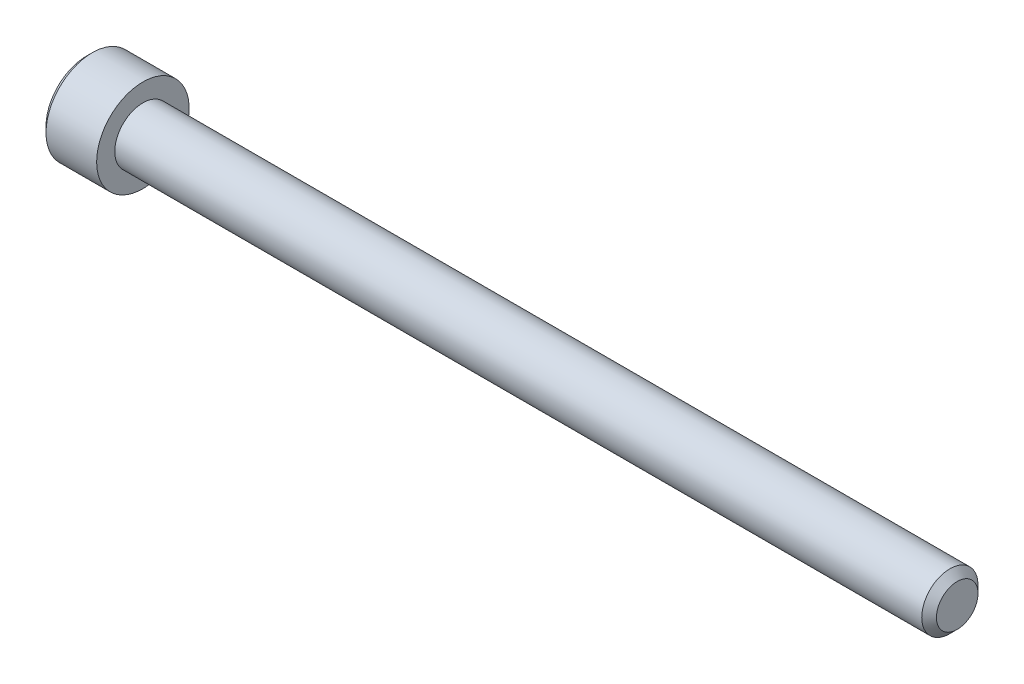
ISO-10303-21;
HEADER;
FILE_DESCRIPTION(('STEP AP214'),'2;1');
FILE_NAME('part.step','',(''),(''),'','','');
FILE_SCHEMA(('AUTOMOTIVE_DESIGN { 1 0 10303 214 1 1 1 1 }'));
ENDSEC;
DATA;
#1=APPLICATION_CONTEXT('core data for automotive mechanical design processes');
#2=APPLICATION_PROTOCOL_DEFINITION('international standard','automotive_design',2000,#1);
#3=PRODUCT_CONTEXT('',#1,'mechanical');
#4=PRODUCT('Part','Part','',(#3));
#5=PRODUCT_RELATED_PRODUCT_CATEGORY('part','',(#4));
#6=PRODUCT_DEFINITION_FORMATION('','',#4);
#7=PRODUCT_DEFINITION_CONTEXT('part definition',#1,'design');
#8=PRODUCT_DEFINITION('design','',#6,#7);
#9=PRODUCT_DEFINITION_SHAPE('','',#8);
#10=(LENGTH_UNIT() NAMED_UNIT(*) SI_UNIT(.MILLI.,.METRE.));
#11=(NAMED_UNIT(*) PLANE_ANGLE_UNIT() SI_UNIT($,.RADIAN.));
#12=(NAMED_UNIT(*) SI_UNIT($,.STERADIAN.) SOLID_ANGLE_UNIT());
#13=UNCERTAINTY_MEASURE_WITH_UNIT(LENGTH_MEASURE(1.E-05),#10,'distance_accuracy_value','');
#14=(GEOMETRIC_REPRESENTATION_CONTEXT(3) GLOBAL_UNCERTAINTY_ASSIGNED_CONTEXT((#13)) GLOBAL_UNIT_ASSIGNED_CONTEXT((#10,
#11,#12)) REPRESENTATION_CONTEXT('',''));
#15=CARTESIAN_POINT('',(0.,0.,0.));
#16=DIRECTION('',(0.,0.,1.));
#17=DIRECTION('',(1.,0.,0.));
#18=AXIS2_PLACEMENT_3D('',#15,#16,#17);
#19=CARTESIAN_POINT('',(-4.826,0.,0.));
#20=DIRECTION('',(-1.,0.,0.));
#21=DIRECTION('',(0.,0.,1.));
#22=AXIS2_PLACEMENT_3D('',#19,#20,#21);
#23=CYLINDRICAL_SURFACE('',#22,2.413);
#24=CARTESIAN_POINT('',(0.,0.,0.));
#25=DIRECTION('',(-1.,0.,0.));
#26=DIRECTION('',(0.,0.,1.));
#27=AXIS2_PLACEMENT_3D('',#24,#25,#26);
#28=CIRCLE('',#27,2.413);
#29=CARTESIAN_POINT('',(0.,0.,2.413));
#30=VERTEX_POINT('',#29);
#31=EDGE_CURVE('E137',#30,#30,#28,.T.);
#32=ORIENTED_EDGE('',*,*,#31,.F.);
#33=EDGE_LOOP('',(#32));
#34=FACE_BOUND('',#33,.T.);
#35=CARTESIAN_POINT('',(69.22008,0.,0.));
#36=DIRECTION('',(-1.,0.,0.));
#37=DIRECTION('',(0.,0.,1.));
#38=AXIS2_PLACEMENT_3D('',#35,#36,#37);
#39=CIRCLE('',#38,2.413);
#40=CARTESIAN_POINT('',(69.22008,0.,2.413));
#41=VERTEX_POINT('',#40);
#42=EDGE_CURVE('E11',#41,#41,#39,.T.);
#43=ORIENTED_EDGE('',*,*,#42,.T.);
#44=EDGE_LOOP('',(#43));
#45=FACE_BOUND('',#44,.T.);
#46=ADVANCED_FACE('F36',(#34,#45),#23,.T.);
#47=CARTESIAN_POINT('',(69.85,0.,0.));
#48=DIRECTION('',(-1.,0.,0.));
#49=DIRECTION('',(0.,0.,1.));
#50=AXIS2_PLACEMENT_3D('',#47,#48,#49);
#51=CONICAL_SURFACE('',#50,1.78308,0.785398163397454);
#52=ORIENTED_EDGE('',*,*,#42,.F.);
#53=EDGE_LOOP('',(#52));
#54=FACE_BOUND('',#53,.T.);
#55=CARTESIAN_POINT('',(69.85,0.,0.));
#56=DIRECTION('',(-1.,0.,0.));
#57=DIRECTION('',(0.,0.,1.));
#58=AXIS2_PLACEMENT_3D('',#55,#56,#57);
#59=CIRCLE('',#58,1.78308);
#60=CARTESIAN_POINT('',(69.85,0.,1.78308));
#61=VERTEX_POINT('',#60);
#62=EDGE_CURVE('E43',#61,#61,#59,.T.);
#63=ORIENTED_EDGE('',*,*,#62,.T.);
#64=EDGE_LOOP('',(#63));
#65=FACE_BOUND('',#64,.T.);
#66=ADVANCED_FACE('F156',(#54,#65),#51,.T.);
#67=CARTESIAN_POINT('',(69.85,0.,-1.78308));
#68=DIRECTION('',(-1.,0.,0.));
#69=DIRECTION('',(0.,0.,1.));
#70=AXIS2_PLACEMENT_3D('',#67,#68,#69);
#71=PLANE('',#70);
#72=ORIENTED_EDGE('',*,*,#62,.F.);
#73=EDGE_LOOP('',(#72));
#74=FACE_BOUND('',#73,.T.);
#75=ADVANCED_FACE('F158',(#74),#71,.F.);
#76=CARTESIAN_POINT('',(-4.826,0.,-3.48615));
#77=DIRECTION('',(1.,0.,0.));
#78=DIRECTION('',(0.,0.,-1.));
#79=AXIS2_PLACEMENT_3D('',#76,#77,#78);
#80=PLANE('',#79);
#81=DIRECTION('',(0.,0.866025403784438,-0.5));
#82=VECTOR('',#81,1.);
#83=CARTESIAN_POINT('',(-4.826,0.,2.2920921156882));
#84=LINE('',#83,#82);
#85=CARTESIAN_POINT('',(-4.826,0.,2.2920921156882));
#86=VERTEX_POINT('',#85);
#87=CARTESIAN_POINT('',(-4.826,1.98501,1.1460460578441));
#88=VERTEX_POINT('',#87);
#89=EDGE_CURVE('E124',#86,#88,#84,.T.);
#90=ORIENTED_EDGE('',*,*,#89,.F.);
#91=DIRECTION('',(0.,0.866025403784439,0.499999999999999));
#92=VECTOR('',#91,1.);
#93=CARTESIAN_POINT('',(-4.826,-1.98501,1.1460460578441));
#94=LINE('',#93,#92);
#95=CARTESIAN_POINT('',(-4.826,-1.98501,1.1460460578441));
#96=VERTEX_POINT('',#95);
#97=EDGE_CURVE('E50',#96,#86,#94,.T.);
#98=ORIENTED_EDGE('',*,*,#97,.F.);
#99=DIRECTION('',(0.,0.,1.));
#100=VECTOR('',#99,1.);
#101=CARTESIAN_POINT('',(-4.826,-1.98501,-1.1460460578441));
#102=LINE('',#101,#100);
#103=CARTESIAN_POINT('',(-4.826,-1.98501,-1.1460460578441));
#104=VERTEX_POINT('',#103);
#105=EDGE_CURVE('E133',#104,#96,#102,.T.);
#106=ORIENTED_EDGE('',*,*,#105,.F.);
#107=DIRECTION('',(0.,-0.866025403784438,0.5));
#108=VECTOR('',#107,1.);
#109=CARTESIAN_POINT('',(-4.826,0.,-2.2920921156882));
#110=LINE('',#109,#108);
#111=CARTESIAN_POINT('',(-4.826,0.,-2.2920921156882));
#112=VERTEX_POINT('',#111);
#113=EDGE_CURVE('E131',#112,#104,#110,.T.);
#114=ORIENTED_EDGE('',*,*,#113,.F.);
#115=DIRECTION('',(0.,-0.866025403784439,-0.5));
#116=VECTOR('',#115,1.);
#117=CARTESIAN_POINT('',(-4.826,1.98501,-1.1460460578441));
#118=LINE('',#117,#116);
#119=CARTESIAN_POINT('',(-4.826,1.98501,-1.1460460578441));
#120=VERTEX_POINT('',#119);
#121=EDGE_CURVE('E98',#120,#112,#118,.T.);
#122=ORIENTED_EDGE('',*,*,#121,.F.);
#123=DIRECTION('',(0.,0.,-1.));
#124=VECTOR('',#123,1.);
#125=CARTESIAN_POINT('',(-4.826,1.98501,1.1460460578441));
#126=LINE('',#125,#124);
#127=EDGE_CURVE('E127',#88,#120,#126,.T.);
#128=ORIENTED_EDGE('',*,*,#127,.F.);
#129=EDGE_LOOP('',(#90,#98,#106,#114,#122,#128));
#130=FACE_BOUND('',#129,.T.);
#131=CARTESIAN_POINT('',(-4.826,0.,0.));
#132=DIRECTION('',(-1.,0.,0.));
#133=DIRECTION('',(0.,0.,1.));
#134=AXIS2_PLACEMENT_3D('',#131,#132,#133);
#135=CIRCLE('',#134,3.48615);
#136=CARTESIAN_POINT('',(-4.826,0.,3.48615));
#137=VERTEX_POINT('',#136);
#138=EDGE_CURVE('E151',#137,#137,#135,.T.);
#139=ORIENTED_EDGE('',*,*,#138,.T.);
#140=EDGE_LOOP('',(#139));
#141=FACE_BOUND('',#140,.T.);
#142=ADVANCED_FACE('F160',(#130,#141),#80,.F.);
#143=CARTESIAN_POINT('',(-4.3434,0.,0.));
#144=DIRECTION('',(1.,0.,0.));
#145=DIRECTION('',(0.,0.,-1.));
#146=AXIS2_PLACEMENT_3D('',#143,#144,#145);
#147=CONICAL_SURFACE('',#146,3.96875,0.785398163397449);
#148=ORIENTED_EDGE('',*,*,#138,.F.);
#149=EDGE_LOOP('',(#148));
#150=FACE_BOUND('',#149,.T.);
#151=CARTESIAN_POINT('',(-4.3434,0.,0.));
#152=DIRECTION('',(-1.,0.,0.));
#153=DIRECTION('',(0.,0.,1.));
#154=AXIS2_PLACEMENT_3D('',#151,#152,#153);
#155=CIRCLE('',#154,3.96875);
#156=CARTESIAN_POINT('',(-4.3434,0.,3.96875));
#157=VERTEX_POINT('',#156);
#158=EDGE_CURVE('E148',#157,#157,#155,.T.);
#159=ORIENTED_EDGE('',*,*,#158,.T.);
#160=EDGE_LOOP('',(#159));
#161=FACE_BOUND('',#160,.T.);
#162=ADVANCED_FACE('F166',(#150,#161),#147,.T.);
#163=CARTESIAN_POINT('',(-4.826,0.,0.));
#164=DIRECTION('',(-1.,0.,0.));
#165=DIRECTION('',(0.,0.,1.));
#166=AXIS2_PLACEMENT_3D('',#163,#164,#165);
#167=CYLINDRICAL_SURFACE('',#166,3.96875);
#168=ORIENTED_EDGE('',*,*,#158,.F.);
#169=EDGE_LOOP('',(#168));
#170=FACE_BOUND('',#169,.T.);
#171=CARTESIAN_POINT('',(0.,0.,0.));
#172=DIRECTION('',(-1.,0.,0.));
#173=DIRECTION('',(0.,0.,1.));
#174=AXIS2_PLACEMENT_3D('',#171,#172,#173);
#175=CIRCLE('',#174,3.96875);
#176=CARTESIAN_POINT('',(0.,0.,3.96875));
#177=VERTEX_POINT('',#176);
#178=EDGE_CURVE('E145',#177,#177,#175,.T.);
#179=ORIENTED_EDGE('',*,*,#178,.T.);
#180=EDGE_LOOP('',(#179));
#181=FACE_BOUND('',#180,.T.);
#182=ADVANCED_FACE('F181',(#170,#181),#167,.T.);
#183=CARTESIAN_POINT('',(0.,0.,-2.413));
#184=DIRECTION('',(-1.,0.,0.));
#185=DIRECTION('',(0.,0.,1.));
#186=AXIS2_PLACEMENT_3D('',#183,#184,#185);
#187=PLANE('',#186);
#188=ORIENTED_EDGE('',*,*,#178,.F.);
#189=EDGE_LOOP('',(#188));
#190=FACE_BOUND('',#189,.T.);
#191=ORIENTED_EDGE('',*,*,#31,.T.);
#192=EDGE_LOOP('',(#191));
#193=FACE_BOUND('',#192,.T.);
#194=ADVANCED_FACE('F178',(#190,#193),#187,.F.);
#195=CARTESIAN_POINT('',(-2.54,-1.98501,1.1460460578441));
#196=DIRECTION('',(0.,-0.499999999999999,0.866025403784439));
#197=DIRECTION('',(0.,-0.866025403784439,-0.499999999999999));
#198=AXIS2_PLACEMENT_3D('',#195,#196,#197);
#199=PLANE('',#198);
#200=ORIENTED_EDGE('',*,*,#97,.T.);
#201=DIRECTION('',(-1.,0.,0.));
#202=VECTOR('',#201,1.);
#203=CARTESIAN_POINT('',(-2.54,0.,2.2920921156882));
#204=LINE('',#203,#202);
#205=CARTESIAN_POINT('',(-2.54,0.,2.2920921156882));
#206=VERTEX_POINT('',#205);
#207=EDGE_CURVE('E80',#206,#86,#204,.T.);
#208=ORIENTED_EDGE('',*,*,#207,.F.);
#209=DIRECTION('',(0.,0.866025403784439,0.499999999999999));
#210=VECTOR('',#209,1.);
#211=CARTESIAN_POINT('',(-2.54,-1.98501,1.1460460578441));
#212=LINE('',#211,#210);
#213=CARTESIAN_POINT('',(-2.54,-1.98501,1.1460460578441));
#214=VERTEX_POINT('',#213);
#215=EDGE_CURVE('E135',#214,#206,#212,.T.);
#216=ORIENTED_EDGE('',*,*,#215,.F.);
#217=DIRECTION('',(-1.,0.,0.));
#218=VECTOR('',#217,1.);
#219=CARTESIAN_POINT('',(-2.54,-1.98501,1.1460460578441));
#220=LINE('',#219,#218);
#221=EDGE_CURVE('E58',#214,#96,#220,.T.);
#222=ORIENTED_EDGE('',*,*,#221,.T.);
#223=EDGE_LOOP('',(#200,#208,#216,#222));
#224=FACE_BOUND('',#223,.T.);
#225=ADVANCED_FACE('F180',(#224),#199,.F.);
#226=CARTESIAN_POINT('',(-2.54,-1.98501,-1.1460460578441));
#227=DIRECTION('',(0.,-1.,0.));
#228=DIRECTION('',(0.,0.,-1.));
#229=AXIS2_PLACEMENT_3D('',#226,#227,#228);
#230=PLANE('',#229);
#231=ORIENTED_EDGE('',*,*,#105,.T.);
#232=ORIENTED_EDGE('',*,*,#221,.F.);
#233=DIRECTION('',(0.,0.,1.));
#234=VECTOR('',#233,1.);
#235=CARTESIAN_POINT('',(-2.54,-1.98501,-1.1460460578441));
#236=LINE('',#235,#234);
#237=CARTESIAN_POINT('',(-2.54,-1.98501,-1.1460460578441));
#238=VERTEX_POINT('',#237);
#239=EDGE_CURVE('E110',#238,#214,#236,.T.);
#240=ORIENTED_EDGE('',*,*,#239,.F.);
#241=DIRECTION('',(-1.,0.,0.));
#242=VECTOR('',#241,1.);
#243=CARTESIAN_POINT('',(-2.54,-1.98501,-1.1460460578441));
#244=LINE('',#243,#242);
#245=EDGE_CURVE('E102',#238,#104,#244,.T.);
#246=ORIENTED_EDGE('',*,*,#245,.T.);
#247=EDGE_LOOP('',(#231,#232,#240,#246));
#248=FACE_BOUND('',#247,.T.);
#249=ADVANCED_FACE('F188',(#248),#230,.F.);
#250=CARTESIAN_POINT('',(-2.54,0.,-2.2920921156882));
#251=DIRECTION('',(0.,-0.5,-0.866025403784438));
#252=DIRECTION('',(0.,0.866025403784439,-0.5));
#253=AXIS2_PLACEMENT_3D('',#250,#251,#252);
#254=PLANE('',#253);
#255=ORIENTED_EDGE('',*,*,#113,.T.);
#256=ORIENTED_EDGE('',*,*,#245,.F.);
#257=DIRECTION('',(0.,-0.866025403784438,0.5));
#258=VECTOR('',#257,1.);
#259=CARTESIAN_POINT('',(-2.54,0.,-2.2920921156882));
#260=LINE('',#259,#258);
#261=CARTESIAN_POINT('',(-2.54,0.,-2.2920921156882));
#262=VERTEX_POINT('',#261);
#263=EDGE_CURVE('E106',#262,#238,#260,.T.);
#264=ORIENTED_EDGE('',*,*,#263,.F.);
#265=DIRECTION('',(-1.,0.,0.));
#266=VECTOR('',#265,1.);
#267=CARTESIAN_POINT('',(-2.54,0.,-2.2920921156882));
#268=LINE('',#267,#266);
#269=EDGE_CURVE('E91',#262,#112,#268,.T.);
#270=ORIENTED_EDGE('',*,*,#269,.T.);
#271=EDGE_LOOP('',(#255,#256,#264,#270));
#272=FACE_BOUND('',#271,.T.);
#273=ADVANCED_FACE('F107',(#272),#254,.F.);
#274=CARTESIAN_POINT('',(-2.54,1.98501,-1.1460460578441));
#275=DIRECTION('',(0.,0.5,-0.866025403784439));
#276=DIRECTION('',(0.,0.866025403784439,0.5));
#277=AXIS2_PLACEMENT_3D('',#274,#275,#276);
#278=PLANE('',#277);
#279=ORIENTED_EDGE('',*,*,#121,.T.);
#280=ORIENTED_EDGE('',*,*,#269,.F.);
#281=DIRECTION('',(0.,-0.866025403784439,-0.5));
#282=VECTOR('',#281,1.);
#283=CARTESIAN_POINT('',(-2.54,1.98501,-1.1460460578441));
#284=LINE('',#283,#282);
#285=CARTESIAN_POINT('',(-2.54,1.98501,-1.1460460578441));
#286=VERTEX_POINT('',#285);
#287=EDGE_CURVE('E95',#286,#262,#284,.T.);
#288=ORIENTED_EDGE('',*,*,#287,.F.);
#289=DIRECTION('',(-1.,0.,0.));
#290=VECTOR('',#289,1.);
#291=CARTESIAN_POINT('',(-2.54,1.98501,-1.1460460578441));
#292=LINE('',#291,#290);
#293=EDGE_CURVE('E103',#286,#120,#292,.T.);
#294=ORIENTED_EDGE('',*,*,#293,.T.);
#295=EDGE_LOOP('',(#279,#280,#288,#294));
#296=FACE_BOUND('',#295,.T.);
#297=ADVANCED_FACE('F93',(#296),#278,.F.);
#298=CARTESIAN_POINT('',(-2.54,1.98501,1.1460460578441));
#299=DIRECTION('',(0.,1.,0.));
#300=DIRECTION('',(0.,0.,1.));
#301=AXIS2_PLACEMENT_3D('',#298,#299,#300);
#302=PLANE('',#301);
#303=ORIENTED_EDGE('',*,*,#127,.T.);
#304=ORIENTED_EDGE('',*,*,#293,.F.);
#305=DIRECTION('',(0.,0.,-1.));
#306=VECTOR('',#305,1.);
#307=CARTESIAN_POINT('',(-2.54,1.98501,1.1460460578441));
#308=LINE('',#307,#306);
#309=CARTESIAN_POINT('',(-2.54,1.98501,1.1460460578441));
#310=VERTEX_POINT('',#309);
#311=EDGE_CURVE('E116',#310,#286,#308,.T.);
#312=ORIENTED_EDGE('',*,*,#311,.F.);
#313=DIRECTION('',(-1.,0.,0.));
#314=VECTOR('',#313,1.);
#315=CARTESIAN_POINT('',(-2.54,1.98501,1.1460460578441));
#316=LINE('',#315,#314);
#317=EDGE_CURVE('E140',#310,#88,#316,.T.);
#318=ORIENTED_EDGE('',*,*,#317,.T.);
#319=EDGE_LOOP('',(#303,#304,#312,#318));
#320=FACE_BOUND('',#319,.T.);
#321=ADVANCED_FACE('F249',(#320),#302,.F.);
#322=CARTESIAN_POINT('',(-2.54,0.,2.2920921156882));
#323=DIRECTION('',(0.,0.5,0.866025403784438));
#324=DIRECTION('',(0.,-0.866025403784439,0.5));
#325=AXIS2_PLACEMENT_3D('',#322,#323,#324);
#326=PLANE('',#325);
#327=ORIENTED_EDGE('',*,*,#89,.T.);
#328=ORIENTED_EDGE('',*,*,#317,.F.);
#329=DIRECTION('',(0.,0.866025403784438,-0.5));
#330=VECTOR('',#329,1.);
#331=CARTESIAN_POINT('',(-2.54,0.,2.2920921156882));
#332=LINE('',#331,#330);
#333=EDGE_CURVE('E118',#206,#310,#332,.T.);
#334=ORIENTED_EDGE('',*,*,#333,.F.);
#335=ORIENTED_EDGE('',*,*,#207,.T.);
#336=EDGE_LOOP('',(#327,#328,#334,#335));
#337=FACE_BOUND('',#336,.T.);
#338=ADVANCED_FACE('F258',(#337),#326,.F.);
#339=CARTESIAN_POINT('',(-2.54,0.,2.2920921156882));
#340=DIRECTION('',(-1.,0.,0.));
#341=DIRECTION('',(0.,0.,1.));
#342=AXIS2_PLACEMENT_3D('',#339,#340,#341);
#343=PLANE('',#342);
#344=ORIENTED_EDGE('',*,*,#215,.T.);
#345=ORIENTED_EDGE('',*,*,#333,.T.);
#346=ORIENTED_EDGE('',*,*,#311,.T.);
#347=ORIENTED_EDGE('',*,*,#287,.T.);
#348=ORIENTED_EDGE('',*,*,#263,.T.);
#349=ORIENTED_EDGE('',*,*,#239,.T.);
#350=EDGE_LOOP('',(#344,#345,#346,#347,#348,#349));
#351=FACE_BOUND('',#350,.T.);
#352=ADVANCED_FACE('F113',(#351),#343,.T.);
#353=CLOSED_SHELL('',(#46,#66,#75,#142,#162,#182,#194,#225,#249,#273,#297,#321,#338,#352));
#354=MANIFOLD_SOLID_BREP('B2',#353);
#355=ADVANCED_BREP_SHAPE_REPRESENTATION('',(#18,#354),#14);
#356=SHAPE_DEFINITION_REPRESENTATION(#9,#355);
ENDSEC;
END-ISO-10303-21;
